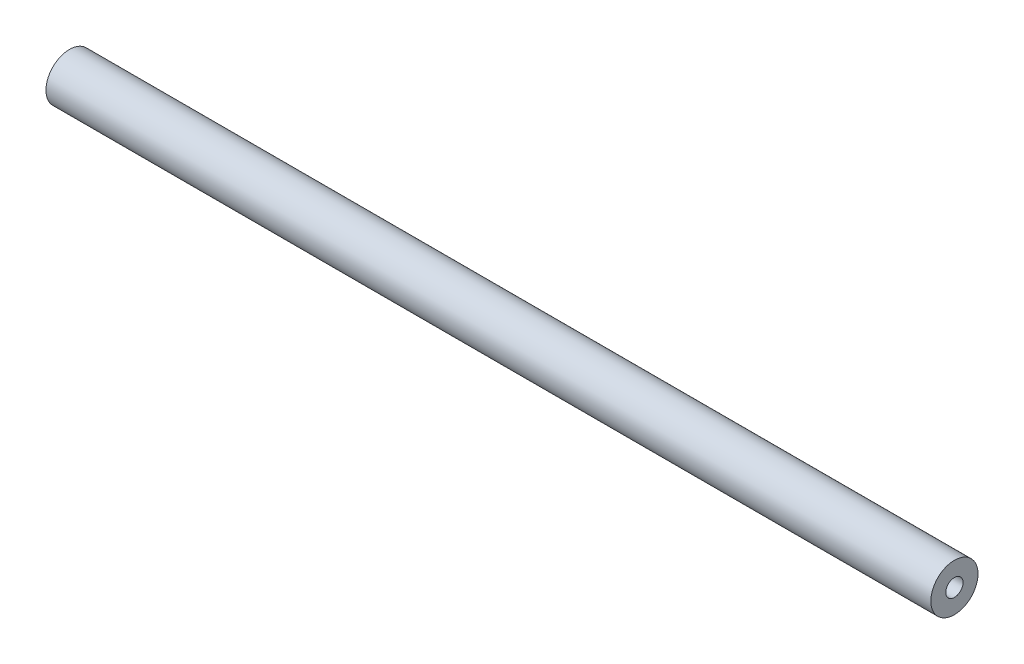
ISO-10303-21;
HEADER;
FILE_DESCRIPTION(('STEP AP214'),'2;1');
FILE_NAME('part.step','',(''),(''),'','','');
FILE_SCHEMA(('AUTOMOTIVE_DESIGN { 1 0 10303 214 1 1 1 1 }'));
ENDSEC;
DATA;
#1=APPLICATION_CONTEXT('core data for automotive mechanical design processes');
#2=APPLICATION_PROTOCOL_DEFINITION('international standard','automotive_design',2000,#1);
#3=PRODUCT_CONTEXT('',#1,'mechanical');
#4=PRODUCT('Part','Part','',(#3));
#5=PRODUCT_RELATED_PRODUCT_CATEGORY('part','',(#4));
#6=PRODUCT_DEFINITION_FORMATION('','',#4);
#7=PRODUCT_DEFINITION_CONTEXT('part definition',#1,'design');
#8=PRODUCT_DEFINITION('design','',#6,#7);
#9=PRODUCT_DEFINITION_SHAPE('','',#8);
#10=(LENGTH_UNIT() NAMED_UNIT(*) SI_UNIT(.MILLI.,.METRE.));
#11=(NAMED_UNIT(*) PLANE_ANGLE_UNIT() SI_UNIT($,.RADIAN.));
#12=(NAMED_UNIT(*) SI_UNIT($,.STERADIAN.) SOLID_ANGLE_UNIT());
#13=UNCERTAINTY_MEASURE_WITH_UNIT(LENGTH_MEASURE(1.E-05),#10,'distance_accuracy_value','');
#14=(GEOMETRIC_REPRESENTATION_CONTEXT(3) GLOBAL_UNCERTAINTY_ASSIGNED_CONTEXT((#13)) GLOBAL_UNIT_ASSIGNED_CONTEXT((#10,
#11,#12)) REPRESENTATION_CONTEXT('',''));
#15=CARTESIAN_POINT('',(0.,0.,0.));
#16=DIRECTION('',(0.,0.,1.));
#17=DIRECTION('',(1.,0.,0.));
#18=AXIS2_PLACEMENT_3D('',#15,#16,#17);
#19=CARTESIAN_POINT('',(168.9,0.,0.));
#20=DIRECTION('',(1.,0.,0.));
#21=DIRECTION('',(0.,0.,-1.));
#22=AXIS2_PLACEMENT_3D('',#19,#20,#21);
#23=PLANE('',#22);
#24=CARTESIAN_POINT('',(168.9,0.,0.));
#25=DIRECTION('',(1.,0.,0.));
#26=DIRECTION('',(0.,0.,-1.));
#27=AXIS2_PLACEMENT_3D('',#24,#25,#26);
#28=CIRCLE('',#27,4.5);
#29=CARTESIAN_POINT('',(168.9,0.,-4.5));
#30=VERTEX_POINT('',#29);
#31=EDGE_CURVE('E10',#30,#30,#28,.T.);
#32=ORIENTED_EDGE('',*,*,#31,.T.);
#33=EDGE_LOOP('',(#32));
#34=FACE_BOUND('',#33,.T.);
#35=CARTESIAN_POINT('',(168.9,0.,0.));
#36=DIRECTION('',(1.,0.,0.));
#37=DIRECTION('',(0.,0.,-1.));
#38=AXIS2_PLACEMENT_3D('',#35,#36,#37);
#39=CIRCLE('',#38,1.65);
#40=CARTESIAN_POINT('',(168.9,0.,-1.65));
#41=VERTEX_POINT('',#40);
#42=EDGE_CURVE('E52',#41,#41,#39,.T.);
#43=ORIENTED_EDGE('',*,*,#42,.F.);
#44=EDGE_LOOP('',(#43));
#45=FACE_BOUND('',#44,.T.);
#46=ADVANCED_FACE('F41',(#34,#45),#23,.T.);
#47=CARTESIAN_POINT('',(0.,0.,0.));
#48=DIRECTION('',(1.,0.,0.));
#49=DIRECTION('',(0.,0.,-1.));
#50=AXIS2_PLACEMENT_3D('',#47,#48,#49);
#51=PLANE('',#50);
#52=CARTESIAN_POINT('',(0.,0.,0.));
#53=DIRECTION('',(1.,0.,0.));
#54=DIRECTION('',(0.,0.,-1.));
#55=AXIS2_PLACEMENT_3D('',#52,#53,#54);
#56=CIRCLE('',#55,4.5);
#57=CARTESIAN_POINT('',(0.,0.,-4.5));
#58=VERTEX_POINT('',#57);
#59=EDGE_CURVE('E45',#58,#58,#56,.T.);
#60=ORIENTED_EDGE('',*,*,#59,.F.);
#61=EDGE_LOOP('',(#60));
#62=FACE_BOUND('',#61,.T.);
#63=CARTESIAN_POINT('',(0.,0.,0.));
#64=DIRECTION('',(1.,0.,0.));
#65=DIRECTION('',(0.,0.,-1.));
#66=AXIS2_PLACEMENT_3D('',#63,#64,#65);
#67=CIRCLE('',#66,1.65);
#68=CARTESIAN_POINT('',(0.,0.,-1.65));
#69=VERTEX_POINT('',#68);
#70=EDGE_CURVE('E54',#69,#69,#67,.T.);
#71=ORIENTED_EDGE('',*,*,#70,.T.);
#72=EDGE_LOOP('',(#71));
#73=FACE_BOUND('',#72,.T.);
#74=ADVANCED_FACE('F64',(#62,#73),#51,.F.);
#75=CARTESIAN_POINT('',(168.9,0.,0.));
#76=DIRECTION('',(-1.,0.,0.));
#77=DIRECTION('',(0.,0.,1.));
#78=AXIS2_PLACEMENT_3D('',#75,#76,#77);
#79=CYLINDRICAL_SURFACE('',#78,4.5);
#80=ORIENTED_EDGE('',*,*,#31,.F.);
#81=EDGE_LOOP('',(#80));
#82=FACE_BOUND('',#81,.T.);
#83=ORIENTED_EDGE('',*,*,#59,.T.);
#84=EDGE_LOOP('',(#83));
#85=FACE_BOUND('',#84,.T.);
#86=ADVANCED_FACE('F43',(#82,#85),#79,.T.);
#87=CARTESIAN_POINT('',(168.9,0.,0.));
#88=DIRECTION('',(-1.,0.,0.));
#89=DIRECTION('',(0.,0.,1.));
#90=AXIS2_PLACEMENT_3D('',#87,#88,#89);
#91=CYLINDRICAL_SURFACE('',#90,1.65);
#92=ORIENTED_EDGE('',*,*,#42,.T.);
#93=EDGE_LOOP('',(#92));
#94=FACE_BOUND('',#93,.T.);
#95=ORIENTED_EDGE('',*,*,#70,.F.);
#96=EDGE_LOOP('',(#95));
#97=FACE_BOUND('',#96,.T.);
#98=ADVANCED_FACE('F60',(#94,#97),#91,.F.);
#99=CLOSED_SHELL('',(#46,#74,#86,#98));
#100=MANIFOLD_SOLID_BREP('B2',#99);
#101=ADVANCED_BREP_SHAPE_REPRESENTATION('',(#18,#100),#14);
#102=SHAPE_DEFINITION_REPRESENTATION(#9,#101);
ENDSEC;
END-ISO-10303-21;
